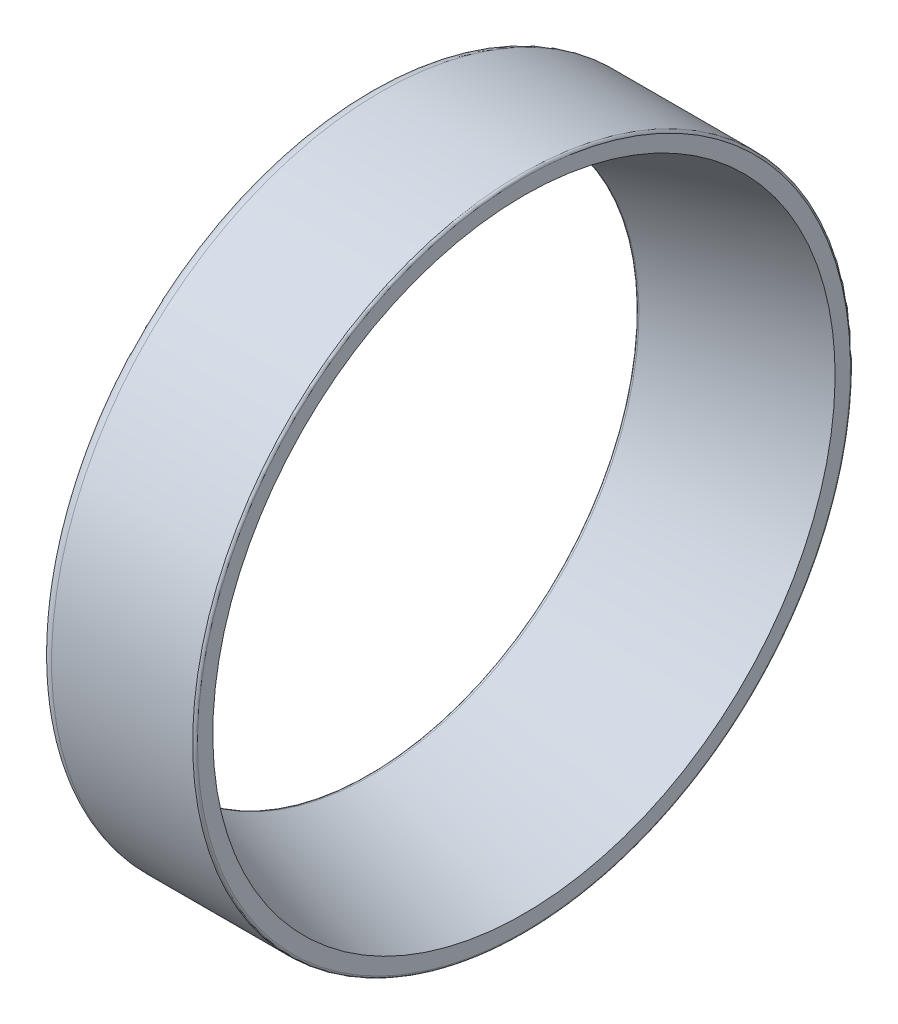
ISO-10303-21;
HEADER;
FILE_DESCRIPTION(('STEP AP214'),'2;1');
FILE_NAME('part.step','',(''),(''),'','','');
FILE_SCHEMA(('AUTOMOTIVE_DESIGN { 1 0 10303 214 1 1 1 1 }'));
ENDSEC;
DATA;
#1=APPLICATION_CONTEXT('core data for automotive mechanical design processes');
#2=APPLICATION_PROTOCOL_DEFINITION('international standard','automotive_design',2000,#1);
#3=PRODUCT_CONTEXT('',#1,'mechanical');
#4=PRODUCT('Part','Part','',(#3));
#5=PRODUCT_RELATED_PRODUCT_CATEGORY('part','',(#4));
#6=PRODUCT_DEFINITION_FORMATION('','',#4);
#7=PRODUCT_DEFINITION_CONTEXT('part definition',#1,'design');
#8=PRODUCT_DEFINITION('design','',#6,#7);
#9=PRODUCT_DEFINITION_SHAPE('','',#8);
#10=(LENGTH_UNIT() NAMED_UNIT(*) SI_UNIT(.MILLI.,.METRE.));
#11=(NAMED_UNIT(*) PLANE_ANGLE_UNIT() SI_UNIT($,.RADIAN.));
#12=(NAMED_UNIT(*) SI_UNIT($,.STERADIAN.) SOLID_ANGLE_UNIT());
#13=UNCERTAINTY_MEASURE_WITH_UNIT(LENGTH_MEASURE(1.E-05),#10,'distance_accuracy_value','');
#14=(GEOMETRIC_REPRESENTATION_CONTEXT(3) GLOBAL_UNCERTAINTY_ASSIGNED_CONTEXT((#13)) GLOBAL_UNIT_ASSIGNED_CONTEXT((#10,
#11,#12)) REPRESENTATION_CONTEXT('',''));
#15=CARTESIAN_POINT('',(0.,0.,0.));
#16=DIRECTION('',(0.,0.,1.));
#17=DIRECTION('',(1.,0.,0.));
#18=AXIS2_PLACEMENT_3D('',#15,#16,#17);
#19=CARTESIAN_POINT('',(0.2,0.,0.));
#20=DIRECTION('',(1.,0.,0.));
#21=DIRECTION('',(0.,0.,-1.));
#22=AXIS2_PLACEMENT_3D('',#19,#20,#21);
#23=TOROIDAL_SURFACE('',#22,22.5541106289311,0.2);
#24=CARTESIAN_POINT('',(0.2551274711634,0.,0.));
#25=DIRECTION('',(1.,0.,0.));
#26=DIRECTION('',(0.,1.,0.));
#27=AXIS2_PLACEMENT_3D('',#24,#25,#26);
#28=CIRCLE('',#27,22.3618582897434);
#29=CARTESIAN_POINT('',(0.2551274711634,22.3618582897434,0.));
#30=VERTEX_POINT('',#29);
#31=EDGE_CURVE('E11',#30,#30,#28,.T.);
#32=ORIENTED_EDGE('',*,*,#31,.T.);
#33=EDGE_LOOP('',(#32));
#34=FACE_BOUND('',#33,.T.);
#35=CARTESIAN_POINT('',(0.,0.,0.));
#36=DIRECTION('',(1.,0.,0.));
#37=DIRECTION('',(0.,1.,0.));
#38=AXIS2_PLACEMENT_3D('',#35,#36,#37);
#39=CIRCLE('',#38,22.5541106289311);
#40=CARTESIAN_POINT('',(0.,22.5541106289311,0.));
#41=VERTEX_POINT('',#40);
#42=EDGE_CURVE('E53',#41,#41,#39,.T.);
#43=ORIENTED_EDGE('',*,*,#42,.F.);
#44=EDGE_LOOP('',(#43));
#45=FACE_BOUND('',#44,.T.);
#46=ADVANCED_FACE('F16',(#34,#45),#23,.T.);
#47=CARTESIAN_POINT('',(6.6275637355817,0.,0.));
#48=DIRECTION('',(1.,0.,0.));
#49=DIRECTION('',(0.,1.,0.));
#50=AXIS2_PLACEMENT_3D('',#47,#48,#49);
#51=CONICAL_SURFACE('',#50,24.1891249846075,0.279252680319093);
#52=CARTESIAN_POINT('',(13.,0.,0.));
#53=DIRECTION('',(1.,0.,0.));
#54=DIRECTION('',(0.,1.,0.));
#55=AXIS2_PLACEMENT_3D('',#52,#53,#54);
#56=CIRCLE('',#55,26.0163916794715);
#57=CARTESIAN_POINT('',(13.,26.0163916794715,0.));
#58=VERTEX_POINT('',#57);
#59=EDGE_CURVE('E26',#58,#58,#56,.T.);
#60=ORIENTED_EDGE('',*,*,#59,.T.);
#61=EDGE_LOOP('',(#60));
#62=FACE_BOUND('',#61,.T.);
#63=ORIENTED_EDGE('',*,*,#31,.F.);
#64=EDGE_LOOP('',(#63));
#65=FACE_BOUND('',#64,.T.);
#66=ADVANCED_FACE('F81',(#62,#65),#51,.F.);
#67=CARTESIAN_POINT('',(13.,26.6581958397358,0.));
#68=DIRECTION('',(1.,0.,0.));
#69=DIRECTION('',(0.,1.,0.));
#70=AXIS2_PLACEMENT_3D('',#67,#68,#69);
#71=PLANE('',#70);
#72=CARTESIAN_POINT('',(13.,0.,0.));
#73=DIRECTION('',(1.,0.,0.));
#74=DIRECTION('',(0.,1.,0.));
#75=AXIS2_PLACEMENT_3D('',#72,#73,#74);
#76=CIRCLE('',#75,27.3);
#77=CARTESIAN_POINT('',(13.,27.3,0.));
#78=VERTEX_POINT('',#77);
#79=EDGE_CURVE('E48',#78,#78,#76,.T.);
#80=ORIENTED_EDGE('',*,*,#79,.T.);
#81=EDGE_LOOP('',(#80));
#82=FACE_BOUND('',#81,.T.);
#83=ORIENTED_EDGE('',*,*,#59,.F.);
#84=EDGE_LOOP('',(#83));
#85=FACE_BOUND('',#84,.T.);
#86=ADVANCED_FACE('F86',(#82,#85),#71,.T.);
#87=CARTESIAN_POINT('',(12.8,0.,0.));
#88=DIRECTION('',(1.,0.,0.));
#89=DIRECTION('',(0.,0.,-1.));
#90=AXIS2_PLACEMENT_3D('',#87,#88,#89);
#91=TOROIDAL_SURFACE('',#90,27.3,0.2);
#92=CARTESIAN_POINT('',(12.8,0.,0.));
#93=DIRECTION('',(1.,0.,0.));
#94=DIRECTION('',(0.,1.,0.));
#95=AXIS2_PLACEMENT_3D('',#92,#93,#94);
#96=CIRCLE('',#95,27.5);
#97=CARTESIAN_POINT('',(12.8,27.5,0.));
#98=VERTEX_POINT('',#97);
#99=EDGE_CURVE('E44',#98,#98,#96,.T.);
#100=ORIENTED_EDGE('',*,*,#99,.T.);
#101=EDGE_LOOP('',(#100));
#102=FACE_BOUND('',#101,.T.);
#103=ORIENTED_EDGE('',*,*,#79,.F.);
#104=EDGE_LOOP('',(#103));
#105=FACE_BOUND('',#104,.T.);
#106=ADVANCED_FACE('F78',(#102,#105),#91,.T.);
#107=CARTESIAN_POINT('',(6.9,0.,0.));
#108=DIRECTION('',(-1.,0.,0.));
#109=DIRECTION('',(0.,1.,0.));
#110=AXIS2_PLACEMENT_3D('',#107,#108,#109);
#111=CYLINDRICAL_SURFACE('',#110,27.5);
#112=CARTESIAN_POINT('',(1.,0.,0.));
#113=DIRECTION('',(1.,0.,0.));
#114=DIRECTION('',(0.,1.,0.));
#115=AXIS2_PLACEMENT_3D('',#112,#113,#114);
#116=CIRCLE('',#115,27.5);
#117=CARTESIAN_POINT('',(1.,27.5,0.));
#118=VERTEX_POINT('',#117);
#119=EDGE_CURVE('E20',#118,#118,#116,.T.);
#120=ORIENTED_EDGE('',*,*,#119,.T.);
#121=EDGE_LOOP('',(#120));
#122=FACE_BOUND('',#121,.T.);
#123=ORIENTED_EDGE('',*,*,#99,.F.);
#124=EDGE_LOOP('',(#123));
#125=FACE_BOUND('',#124,.T.);
#126=ADVANCED_FACE('F68',(#122,#125),#111,.T.);
#127=CARTESIAN_POINT('',(1.,0.,0.));
#128=DIRECTION('',(1.,0.,0.));
#129=DIRECTION('',(0.,0.,-1.));
#130=AXIS2_PLACEMENT_3D('',#127,#128,#129);
#131=TOROIDAL_SURFACE('',#130,26.5,1.);
#132=CARTESIAN_POINT('',(0.,0.,0.));
#133=DIRECTION('',(1.,0.,0.));
#134=DIRECTION('',(0.,1.,0.));
#135=AXIS2_PLACEMENT_3D('',#132,#133,#134);
#136=CIRCLE('',#135,26.5);
#137=CARTESIAN_POINT('',(0.,26.5,0.));
#138=VERTEX_POINT('',#137);
#139=EDGE_CURVE('E57',#138,#138,#136,.T.);
#140=ORIENTED_EDGE('',*,*,#139,.T.);
#141=EDGE_LOOP('',(#140));
#142=FACE_BOUND('',#141,.T.);
#143=ORIENTED_EDGE('',*,*,#119,.F.);
#144=EDGE_LOOP('',(#143));
#145=FACE_BOUND('',#144,.T.);
#146=ADVANCED_FACE('F18',(#142,#145),#131,.T.);
#147=CARTESIAN_POINT('',(0.,24.5270553144655,0.));
#148=DIRECTION('',(-1.,0.,0.));
#149=DIRECTION('',(0.,-1.,0.));
#150=AXIS2_PLACEMENT_3D('',#147,#148,#149);
#151=PLANE('',#150);
#152=ORIENTED_EDGE('',*,*,#42,.T.);
#153=EDGE_LOOP('',(#152));
#154=FACE_BOUND('',#153,.T.);
#155=ORIENTED_EDGE('',*,*,#139,.F.);
#156=EDGE_LOOP('',(#155));
#157=FACE_BOUND('',#156,.T.);
#158=ADVANCED_FACE('F71',(#154,#157),#151,.T.);
#159=CLOSED_SHELL('',(#46,#66,#86,#106,#126,#146,#158));
#160=MANIFOLD_SOLID_BREP('B1',#159);
#161=ADVANCED_BREP_SHAPE_REPRESENTATION('',(#18,#160),#14);
#162=SHAPE_DEFINITION_REPRESENTATION(#9,#161);
ENDSEC;
END-ISO-10303-21;
